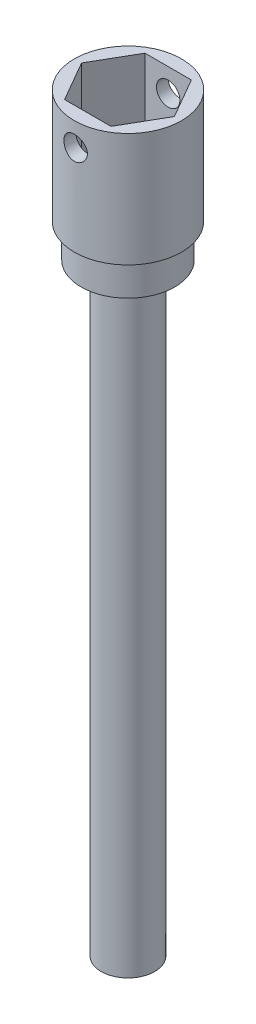
ISO-10303-21;
HEADER;
FILE_DESCRIPTION(('STEP AP214'),'2;1');
FILE_NAME('part.step','',(''),(''),'','','');
FILE_SCHEMA(('AUTOMOTIVE_DESIGN { 1 0 10303 214 1 1 1 1 }'));
ENDSEC;
DATA;
#1=APPLICATION_CONTEXT('core data for automotive mechanical design processes');
#2=APPLICATION_PROTOCOL_DEFINITION('international standard','automotive_design',2000,#1);
#3=PRODUCT_CONTEXT('',#1,'mechanical');
#4=PRODUCT('Part','Part','',(#3));
#5=PRODUCT_RELATED_PRODUCT_CATEGORY('part','',(#4));
#6=PRODUCT_DEFINITION_FORMATION('','',#4);
#7=PRODUCT_DEFINITION_CONTEXT('part definition',#1,'design');
#8=PRODUCT_DEFINITION('design','',#6,#7);
#9=PRODUCT_DEFINITION_SHAPE('','',#8);
#10=(LENGTH_UNIT() NAMED_UNIT(*) SI_UNIT(.MILLI.,.METRE.));
#11=(NAMED_UNIT(*) PLANE_ANGLE_UNIT() SI_UNIT($,.RADIAN.));
#12=(NAMED_UNIT(*) SI_UNIT($,.STERADIAN.) SOLID_ANGLE_UNIT());
#13=UNCERTAINTY_MEASURE_WITH_UNIT(LENGTH_MEASURE(1.E-05),#10,'distance_accuracy_value','');
#14=(GEOMETRIC_REPRESENTATION_CONTEXT(3) GLOBAL_UNCERTAINTY_ASSIGNED_CONTEXT((#13)) GLOBAL_UNIT_ASSIGNED_CONTEXT((#10,
#11,#12)) REPRESENTATION_CONTEXT('',''));
#15=CARTESIAN_POINT('',(0.,0.,0.));
#16=DIRECTION('',(0.,0.,1.));
#17=DIRECTION('',(1.,0.,0.));
#18=AXIS2_PLACEMENT_3D('',#15,#16,#17);
#19=CARTESIAN_POINT('',(0.,-5.,0.));
#20=DIRECTION('',(0.,-1.,0.));
#21=DIRECTION('',(0.,0.,-1.));
#22=AXIS2_PLACEMENT_3D('',#19,#20,#21);
#23=PLANE('',#22);
#24=CARTESIAN_POINT('',(0.,-5.,0.));
#25=DIRECTION('',(0.,-1.,0.));
#26=DIRECTION('',(0.,0.,-1.));
#27=AXIS2_PLACEMENT_3D('',#24,#25,#26);
#28=CIRCLE('',#27,7.);
#29=CARTESIAN_POINT('',(0.,-5.,-7.));
#30=VERTEX_POINT('',#29);
#31=EDGE_CURVE('E11',#30,#30,#28,.T.);
#32=ORIENTED_EDGE('',*,*,#31,.T.);
#33=EDGE_LOOP('',(#32));
#34=FACE_BOUND('',#33,.T.);
#35=CARTESIAN_POINT('',(0.,-5.,0.));
#36=DIRECTION('',(0.,-1.,0.));
#37=DIRECTION('',(0.,0.,-1.));
#38=AXIS2_PLACEMENT_3D('',#35,#36,#37);
#39=CIRCLE('',#38,4.005);
#40=CARTESIAN_POINT('',(0.,-5.,-4.005));
#41=VERTEX_POINT('',#40);
#42=EDGE_CURVE('E59',#41,#41,#39,.T.);
#43=ORIENTED_EDGE('',*,*,#42,.F.);
#44=EDGE_LOOP('',(#43));
#45=FACE_BOUND('',#44,.T.);
#46=ADVANCED_FACE('F48',(#34,#45),#23,.T.);
#47=CARTESIAN_POINT('',(0.,0.,0.));
#48=DIRECTION('',(0.,-1.,0.));
#49=DIRECTION('',(0.,0.,-1.));
#50=AXIS2_PLACEMENT_3D('',#47,#48,#49);
#51=PLANE('',#50);
#52=CARTESIAN_POINT('',(0.,0.,0.));
#53=DIRECTION('',(0.,-1.,0.));
#54=DIRECTION('',(0.,0.,-1.));
#55=AXIS2_PLACEMENT_3D('',#52,#53,#54);
#56=CIRCLE('',#55,7.);
#57=CARTESIAN_POINT('',(0.,0.,-7.));
#58=VERTEX_POINT('',#57);
#59=EDGE_CURVE('E52',#58,#58,#56,.T.);
#60=ORIENTED_EDGE('',*,*,#59,.F.);
#61=EDGE_LOOP('',(#60));
#62=FACE_BOUND('',#61,.T.);
#63=CARTESIAN_POINT('',(0.,0.,0.));
#64=DIRECTION('',(0.,-1.,0.));
#65=DIRECTION('',(0.,0.,-1.));
#66=AXIS2_PLACEMENT_3D('',#63,#64,#65);
#67=CIRCLE('',#66,4.005);
#68=CARTESIAN_POINT('',(0.,0.,-4.005));
#69=VERTEX_POINT('',#68);
#70=EDGE_CURVE('E61',#69,#69,#67,.T.);
#71=ORIENTED_EDGE('',*,*,#70,.T.);
#72=EDGE_LOOP('',(#71));
#73=FACE_BOUND('',#72,.T.);
#74=ADVANCED_FACE('F71',(#62,#73),#51,.F.);
#75=CARTESIAN_POINT('',(0.,-5.,0.));
#76=DIRECTION('',(0.,1.,0.));
#77=DIRECTION('',(0.,0.,1.));
#78=AXIS2_PLACEMENT_3D('',#75,#76,#77);
#79=CYLINDRICAL_SURFACE('',#78,7.);
#80=ORIENTED_EDGE('',*,*,#31,.F.);
#81=EDGE_LOOP('',(#80));
#82=FACE_BOUND('',#81,.T.);
#83=ORIENTED_EDGE('',*,*,#59,.T.);
#84=EDGE_LOOP('',(#83));
#85=FACE_BOUND('',#84,.T.);
#86=ADVANCED_FACE('F50',(#82,#85),#79,.T.);
#87=CARTESIAN_POINT('',(0.,-5.,0.));
#88=DIRECTION('',(0.,1.,0.));
#89=DIRECTION('',(0.,0.,1.));
#90=AXIS2_PLACEMENT_3D('',#87,#88,#89);
#91=CYLINDRICAL_SURFACE('',#90,4.005);
#92=ORIENTED_EDGE('',*,*,#42,.T.);
#93=EDGE_LOOP('',(#92));
#94=FACE_BOUND('',#93,.T.);
#95=ORIENTED_EDGE('',*,*,#70,.F.);
#96=EDGE_LOOP('',(#95));
#97=FACE_BOUND('',#96,.T.);
#98=ADVANCED_FACE('F67',(#94,#97),#91,.F.);
#99=CLOSED_SHELL('',(#46,#74,#86,#98));
#100=MANIFOLD_SOLID_BREP('B2',#99);
#101=CARTESIAN_POINT('',(0.,-95.,0.));
#102=DIRECTION('',(0.,1.,0.));
#103=DIRECTION('',(0.,0.,1.));
#104=AXIS2_PLACEMENT_3D('',#101,#102,#103);
#105=CYLINDRICAL_SURFACE('',#104,4.);
#106=CARTESIAN_POINT('',(0.,-95.,0.));
#107=DIRECTION('',(0.,-1.,0.));
#108=DIRECTION('',(0.,0.,-1.));
#109=AXIS2_PLACEMENT_3D('',#106,#107,#108);
#110=CIRCLE('',#109,4.);
#111=CARTESIAN_POINT('',(0.,-95.,-4.));
#112=VERTEX_POINT('',#111);
#113=EDGE_CURVE('E47',#112,#112,#110,.T.);
#114=ORIENTED_EDGE('',*,*,#113,.F.);
#115=EDGE_LOOP('',(#114));
#116=FACE_BOUND('',#115,.T.);
#117=CARTESIAN_POINT('',(0.,0.,0.));
#118=DIRECTION('',(0.,-1.,0.));
#119=DIRECTION('',(0.,0.,-1.));
#120=AXIS2_PLACEMENT_3D('',#117,#118,#119);
#121=CIRCLE('',#120,4.);
#122=CARTESIAN_POINT('',(0.,0.,-4.));
#123=VERTEX_POINT('',#122);
#124=EDGE_CURVE('E122',#123,#123,#121,.T.);
#125=ORIENTED_EDGE('',*,*,#124,.T.);
#126=EDGE_LOOP('',(#125));
#127=FACE_BOUND('',#126,.T.);
#128=ADVANCED_FACE('F119',(#116,#127),#105,.T.);
#129=CARTESIAN_POINT('',(0.,-95.,0.));
#130=DIRECTION('',(0.,-1.,0.));
#131=DIRECTION('',(0.,0.,-1.));
#132=AXIS2_PLACEMENT_3D('',#129,#130,#131);
#133=PLANE('',#132);
#134=ORIENTED_EDGE('',*,*,#113,.T.);
#135=EDGE_LOOP('',(#134));
#136=FACE_BOUND('',#135,.T.);
#137=ADVANCED_FACE('F134',(#136),#133,.T.);
#138=CARTESIAN_POINT('',(0.,0.,0.));
#139=DIRECTION('',(0.,-1.,0.));
#140=DIRECTION('',(0.,0.,-1.));
#141=AXIS2_PLACEMENT_3D('',#138,#139,#140);
#142=PLANE('',#141);
#143=ORIENTED_EDGE('',*,*,#124,.F.);
#144=EDGE_LOOP('',(#143));
#145=FACE_BOUND('',#144,.T.);
#146=ADVANCED_FACE('F132',(#145),#142,.F.);
#147=CLOSED_SHELL('',(#128,#137,#146));
#148=MANIFOLD_SOLID_BREP('B6',#147);
#149=CARTESIAN_POINT('',(0.,17.,0.));
#150=DIRECTION('',(0.,1.,0.));
#151=DIRECTION('',(0.,0.,1.));
#152=AXIS2_PLACEMENT_3D('',#149,#150,#151);
#153=PLANE('',#152);
#154=CARTESIAN_POINT('',(0.,17.,0.));
#155=DIRECTION('',(0.,1.,0.));
#156=DIRECTION('',(0.,0.,1.));
#157=AXIS2_PLACEMENT_3D('',#154,#155,#156);
#158=CIRCLE('',#157,8.);
#159=CARTESIAN_POINT('',(0.,17.,8.));
#160=VERTEX_POINT('',#159);
#161=EDGE_CURVE('E117',#160,#160,#158,.T.);
#162=ORIENTED_EDGE('',*,*,#161,.T.);
#163=EDGE_LOOP('',(#162));
#164=FACE_BOUND('',#163,.T.);
#165=DIRECTION('',(0.5,0.,0.866025403784438));
#166=VECTOR('',#165,1.);
#167=CARTESIAN_POINT('',(-6.92820323027551,17.,0.));
#168=LINE('',#167,#166);
#169=CARTESIAN_POINT('',(-6.92820323027551,17.,0.));
#170=VERTEX_POINT('',#169);
#171=CARTESIAN_POINT('',(-3.46410161513773,17.,6.00000000000003));
#172=VERTEX_POINT('',#171);
#173=EDGE_CURVE('E224',#170,#172,#168,.T.);
#174=ORIENTED_EDGE('',*,*,#173,.F.);
#175=DIRECTION('',(-0.499999999999995,0.,0.866025403784442));
#176=VECTOR('',#175,1.);
#177=CARTESIAN_POINT('',(-3.46410161513782,17.,-5.99999999999996));
#178=LINE('',#177,#176);
#179=CARTESIAN_POINT('',(-3.46410161513782,17.,-5.99999999999996));
#180=VERTEX_POINT('',#179);
#181=EDGE_CURVE('E216',#180,#170,#178,.T.);
#182=ORIENTED_EDGE('',*,*,#181,.F.);
#183=DIRECTION('',(-1.,0.,0.));
#184=VECTOR('',#183,1.);
#185=CARTESIAN_POINT('',(3.4641016151377,17.,-6.00000000000003));
#186=LINE('',#185,#184);
#187=CARTESIAN_POINT('',(3.4641016151377,17.,-6.00000000000003));
#188=VERTEX_POINT('',#187);
#189=EDGE_CURVE('E245',#188,#180,#186,.T.);
#190=ORIENTED_EDGE('',*,*,#189,.F.);
#191=DIRECTION('',(-0.500000000000008,0.,-0.866025403784434));
#192=VECTOR('',#191,1.);
#193=CARTESIAN_POINT('',(6.92820323027552,17.,0.));
#194=LINE('',#193,#192);
#195=CARTESIAN_POINT('',(6.92820323027552,17.,0.));
#196=VERTEX_POINT('',#195);
#197=EDGE_CURVE('E243',#196,#188,#194,.T.);
#198=ORIENTED_EDGE('',*,*,#197,.F.);
#199=DIRECTION('',(0.499999999999996,0.,-0.866025403784441));
#200=VECTOR('',#199,1.);
#201=CARTESIAN_POINT('',(3.46410161513779,17.,6.));
#202=LINE('',#201,#200);
#203=CARTESIAN_POINT('',(3.46410161513779,17.,6.));
#204=VERTEX_POINT('',#203);
#205=EDGE_CURVE('E238',#204,#196,#202,.T.);
#206=ORIENTED_EDGE('',*,*,#205,.F.);
#207=DIRECTION('',(1.,0.,0.));
#208=VECTOR('',#207,1.);
#209=CARTESIAN_POINT('',(-3.46410161513773,17.,6.00000000000003));
#210=LINE('',#209,#208);
#211=EDGE_CURVE('E236',#172,#204,#210,.T.);
#212=ORIENTED_EDGE('',*,*,#211,.F.);
#213=EDGE_LOOP('',(#174,#182,#190,#198,#206,#212));
#214=FACE_BOUND('',#213,.T.);
#215=ADVANCED_FACE('F160',(#164,#214),#153,.T.);
#216=CARTESIAN_POINT('',(0.,0.,0.));
#217=DIRECTION('',(0.,1.,0.));
#218=DIRECTION('',(0.,0.,1.));
#219=AXIS2_PLACEMENT_3D('',#216,#217,#218);
#220=PLANE('',#219);
#221=CARTESIAN_POINT('',(0.,0.,0.));
#222=DIRECTION('',(0.,1.,0.));
#223=DIRECTION('',(0.,0.,1.));
#224=AXIS2_PLACEMENT_3D('',#221,#222,#223);
#225=CIRCLE('',#224,8.);
#226=CARTESIAN_POINT('',(0.,0.,8.));
#227=VERTEX_POINT('',#226);
#228=EDGE_CURVE('E170',#227,#227,#225,.T.);
#229=ORIENTED_EDGE('',*,*,#228,.F.);
#230=EDGE_LOOP('',(#229));
#231=FACE_BOUND('',#230,.T.);
#232=DIRECTION('',(-0.499999999999995,0.,0.866025403784442));
#233=VECTOR('',#232,1.);
#234=CARTESIAN_POINT('',(-3.46410161513782,0.,-5.99999999999996));
#235=LINE('',#234,#233);
#236=CARTESIAN_POINT('',(-3.46410161513782,0.,-5.99999999999996));
#237=VERTEX_POINT('',#236);
#238=CARTESIAN_POINT('',(-6.92820323027551,0.,0.));
#239=VERTEX_POINT('',#238);
#240=EDGE_CURVE('E186',#237,#239,#235,.T.);
#241=ORIENTED_EDGE('',*,*,#240,.T.);
#242=DIRECTION('',(0.5,0.,0.866025403784438));
#243=VECTOR('',#242,1.);
#244=CARTESIAN_POINT('',(-6.92820323027551,0.,0.));
#245=LINE('',#244,#243);
#246=CARTESIAN_POINT('',(-3.46410161513773,0.,6.00000000000003));
#247=VERTEX_POINT('',#246);
#248=EDGE_CURVE('E231',#239,#247,#245,.T.);
#249=ORIENTED_EDGE('',*,*,#248,.T.);
#250=DIRECTION('',(1.,0.,0.));
#251=VECTOR('',#250,1.);
#252=CARTESIAN_POINT('',(-3.46410161513773,0.,6.00000000000003));
#253=LINE('',#252,#251);
#254=CARTESIAN_POINT('',(3.46410161513779,0.,6.));
#255=VERTEX_POINT('',#254);
#256=EDGE_CURVE('E250',#247,#255,#253,.T.);
#257=ORIENTED_EDGE('',*,*,#256,.T.);
#258=DIRECTION('',(0.499999999999996,0.,-0.866025403784441));
#259=VECTOR('',#258,1.);
#260=CARTESIAN_POINT('',(3.46410161513779,0.,6.));
#261=LINE('',#260,#259);
#262=CARTESIAN_POINT('',(6.92820323027552,0.,0.));
#263=VERTEX_POINT('',#262);
#264=EDGE_CURVE('E253',#255,#263,#261,.T.);
#265=ORIENTED_EDGE('',*,*,#264,.T.);
#266=DIRECTION('',(-0.500000000000008,0.,-0.866025403784434));
#267=VECTOR('',#266,1.);
#268=CARTESIAN_POINT('',(6.92820323027552,0.,0.));
#269=LINE('',#268,#267);
#270=CARTESIAN_POINT('',(3.4641016151377,0.,-6.00000000000003));
#271=VERTEX_POINT('',#270);
#272=EDGE_CURVE('E256',#263,#271,#269,.T.);
#273=ORIENTED_EDGE('',*,*,#272,.T.);
#274=DIRECTION('',(-1.,0.,0.));
#275=VECTOR('',#274,1.);
#276=CARTESIAN_POINT('',(3.4641016151377,0.,-6.00000000000003));
#277=LINE('',#276,#275);
#278=EDGE_CURVE('E225',#271,#237,#277,.T.);
#279=ORIENTED_EDGE('',*,*,#278,.T.);
#280=EDGE_LOOP('',(#241,#249,#257,#265,#273,#279));
#281=FACE_BOUND('',#280,.T.);
#282=ADVANCED_FACE('F271',(#231,#281),#220,.F.);
#283=CARTESIAN_POINT('',(0.,17.,0.));
#284=DIRECTION('',(0.,-1.,0.));
#285=DIRECTION('',(0.,0.,-1.));
#286=AXIS2_PLACEMENT_3D('',#283,#284,#285);
#287=CYLINDRICAL_SURFACE('',#286,8.);
#288=CARTESIAN_POINT('',(0.,15.2499999999999,-8.));
#289=CARTESIAN_POINT('',(-0.0970593350151568,15.2499966857365,-7.99999820976199));
#290=CARTESIAN_POINT('',(-0.194158718935758,15.2418980133387,-7.99821570498197));
#291=CARTESIAN_POINT('',(-0.385599393425184,15.2097509472335,-7.99127711250709));
#292=CARTESIAN_POINT('',(-0.479938663088234,15.1856911578552,-7.98611861450843));
#293=CARTESIAN_POINT('',(-0.663064722809438,15.1224115117151,-7.973002390759));
#294=CARTESIAN_POINT('',(-0.75185720118225,15.08320749224,-7.96504759005983));
#295=CARTESIAN_POINT('',(-0.921601058551551,14.9908025033185,-7.94719730036193));
#296=CARTESIAN_POINT('',(-1.00255264012584,14.9376018956207,-7.93730186152161));
#297=CARTESIAN_POINT('',(-1.155619179022,14.8178102893751,-7.9164767370517));
#298=CARTESIAN_POINT('',(-1.2275902777149,14.751037686599,-7.90553422192293));
#299=CARTESIAN_POINT('',(-1.35940547452628,14.6063873870963,-7.88393863133686));
#300=CARTESIAN_POINT('',(-1.41924849117723,14.5285087010883,-7.87328558176462));
#301=CARTESIAN_POINT('',(-1.52574354875189,14.3627932344162,-7.85334859305538));
#302=CARTESIAN_POINT('',(-1.57224243577137,14.2748558768205,-7.84408109293136));
#303=CARTESIAN_POINT('',(-1.64974688983707,14.0921791579887,-7.82814863989338));
#304=CARTESIAN_POINT('',(-1.6807543098141,13.9974406117921,-7.82148337574742));
#305=CARTESIAN_POINT('',(-1.72592019766615,13.8054113049613,-7.8116407126826));
#306=CARTESIAN_POINT('',(-1.74033336961635,13.7081832087146,-7.80841064772011));
#307=CARTESIAN_POINT('',(-1.75269359259673,13.5126394392105,-7.80564592573969));
#308=CARTESIAN_POINT('',(-1.75064266801701,13.414323901147,-7.80611081439809));
#309=CARTESIAN_POINT('',(-1.73033788658276,13.2212896648966,-7.81063579363394));
#310=CARTESIAN_POINT('',(-1.71237992433052,13.1265380699422,-7.81463022611758));
#311=CARTESIAN_POINT('',(-1.66123961776059,12.9414258870834,-7.8256604106414));
#312=CARTESIAN_POINT('',(-1.62805641913033,12.8510655458941,-7.83269633334323));
#313=CARTESIAN_POINT('',(-1.54713590259171,12.6764690657103,-7.84908142575242));
#314=CARTESIAN_POINT('',(-1.49928481262597,12.5922874135789,-7.85844856683515));
#315=CARTESIAN_POINT('',(-1.39046682908876,12.4330390817803,-7.87842963219283));
#316=CARTESIAN_POINT('',(-1.32949814730239,12.357973647038,-7.88904372636513));
#317=CARTESIAN_POINT('',(-1.19460937489087,12.2173850396079,-7.91060446260823));
#318=CARTESIAN_POINT('',(-1.12043767851041,12.1521033752664,-7.92155333191846));
#319=CARTESIAN_POINT('',(-0.962075236204424,12.0348662374023,-7.94234089245358));
#320=CARTESIAN_POINT('',(-0.87788430875849,11.9829110053711,-7.95217956355851));
#321=CARTESIAN_POINT('',(-0.701578448800898,11.8937418423677,-7.96967012140718));
#322=CARTESIAN_POINT('',(-0.609447011102176,11.8565595639266,-7.97731730300528));
#323=CARTESIAN_POINT('',(-0.420039431240226,11.7982711330325,-7.98952827368579));
#324=CARTESIAN_POINT('',(-0.322764039566515,11.7771626423382,-7.99409251123072));
#325=CARTESIAN_POINT('',(-0.127901429629277,11.7519722661836,-7.99955949359536));
#326=CARTESIAN_POINT('',(-0.0303587923625141,11.7475604773187,-8.00053317276936));
#327=CARTESIAN_POINT('',(0.164069740933597,11.754994543501,-7.99890811067611));
#328=CARTESIAN_POINT('',(0.260955681068746,11.7668392956148,-7.99630961176511));
#329=CARTESIAN_POINT('',(0.450227474165031,11.8061766648839,-7.98787693126456));
#330=CARTESIAN_POINT('',(0.542651027433137,11.833496241809,-7.98207854907296));
#331=CARTESIAN_POINT('',(0.721603760326831,11.9028156860869,-7.96789511342712));
#332=CARTESIAN_POINT('',(0.808132436960034,11.9448168043023,-7.9595098395777));
#333=CARTESIAN_POINT('',(0.974203283713454,12.0429944136583,-7.94090779663355));
#334=CARTESIAN_POINT('',(1.05362808603414,12.0993647035378,-7.93066659115627));
#335=CARTESIAN_POINT('',(1.20200932191059,12.2244253113372,-7.90953858077061));
#336=CARTESIAN_POINT('',(1.27096439342607,12.2931172296854,-7.89865169211902));
#337=CARTESIAN_POINT('',(1.39775310506222,12.4423850233085,-7.87721432670252));
#338=CARTESIAN_POINT('',(1.45535830381521,12.5231566231091,-7.86667375069788));
#339=CARTESIAN_POINT('',(1.55618726114731,12.693421578692,-7.84735161891499));
#340=CARTESIAN_POINT('',(1.59941164199047,12.78291455688,-7.83856998703301));
#341=CARTESIAN_POINT('',(1.66996009440656,12.9676020353281,-7.82384388791898));
#342=CARTESIAN_POINT('',(1.69737356394435,13.0627610548624,-7.81788350386447));
#343=CARTESIAN_POINT('',(1.73578387332259,13.2564820046402,-7.80944608385001));
#344=CARTESIAN_POINT('',(1.74678333897319,13.3550433880131,-7.80696849073852));
#345=CARTESIAN_POINT('',(1.75194163710036,13.5504679246802,-7.80581228747135));
#346=CARTESIAN_POINT('',(1.74646267912382,13.6473212096173,-7.80705196674951));
#347=CARTESIAN_POINT('',(1.71962942041951,13.8386886230968,-7.81300583032521));
#348=CARTESIAN_POINT('',(1.69827530684459,13.9332027792018,-7.81771997366216));
#349=CARTESIAN_POINT('',(1.64047291068321,14.1169212316383,-7.83005176572581));
#350=CARTESIAN_POINT('',(1.60407735181825,14.2061428425726,-7.83765926522138));
#351=CARTESIAN_POINT('',(1.51727048968557,14.3772672915549,-7.85492457749755));
#352=CARTESIAN_POINT('',(1.46685772585975,14.4591693657495,-7.86458260391319));
#353=CARTESIAN_POINT('',(1.35224615086074,14.6151153484137,-7.88510483142733));
#354=CARTESIAN_POINT('',(1.28778921304296,14.6889668945064,-7.8959894715946));
#355=CARTESIAN_POINT('',(1.14744205512982,14.8249242469262,-7.91760116007138));
#356=CARTESIAN_POINT('',(1.07154919548317,14.8870273340813,-7.92832817136923));
#357=CARTESIAN_POINT('',(0.909297791240121,14.9984963348522,-7.94858104101301));
#358=CARTESIAN_POINT('',(0.822816221637395,15.0476865127493,-7.95808950687133));
#359=CARTESIAN_POINT('',(0.642622783374196,15.1307547003765,-7.97465942662438));
#360=CARTESIAN_POINT('',(0.548917055005199,15.1646455496341,-7.98172293121789));
#361=CARTESIAN_POINT('',(0.379265181966453,15.210114036239,-7.99134698819861));
#362=CARTESIAN_POINT('',(0.304236707923574,15.2250427289055,-7.99457176616468));
#363=CARTESIAN_POINT('',(0.152813724405265,15.2449867958046,-7.99889892979335));
#364=CARTESIAN_POINT('',(0.0764192756345309,15.2500026094719,-8.00000140953667));
#365=CARTESIAN_POINT('',(0.,15.2499999999999,-8.));
#366=B_SPLINE_CURVE_WITH_KNOTS('',3,(#288,#289,#290,#291,#292,#293,#294,#295,#296,#297,#298,
#299,#300,#301,#302,#303,#304,#305,#306,#307,#308,#309,#310,#311,#312,#313,#314,#315,#316,#317,
#318,#319,#320,#321,#322,#323,#324,#325,#326,#327,#328,#329,#330,#331,#332,#333,#334,#335,#336,
#337,#338,#339,#340,#341,#342,#343,#344,#345,#346,#347,#348,#349,#350,#351,#352,#353,#354,#355,
#356,#357,#358,#359,#360,#361,#362,#363,#364,#365),.UNSPECIFIED.,.T.,.F.,(4,2,2,2,2,2,2,2,2,2,2,
2,2,2,2,2,2,2,2,2,2,2,2,2,2,2,2,2,2,2,2,2,2,2,2,2,2,2,4),(0.,0.29089827923684,0.582004473361998,
0.87280705974439,1.16360213093147,1.45858009706573,1.75358435498014,2.05185017097233,
2.35008030291283,2.64366919108486,2.93722198074794,3.2254263046948,3.51364680222934,
3.80416202417264,4.09471687482157,4.39155618463566,4.68840087316595,4.98587819489094,
5.28331223455302,5.57483775277423,5.86634349327379,6.15465219015957,6.44298545684136,
6.73543477188134,7.02792210003636,7.32580107786366,7.62366716466516,7.91983211728085,
8.21594968619011,8.50560626091032,8.79525942091157,9.08390577736418,9.37258222133142,
9.66709530846808,9.96167647726491,10.2600801610665,10.5582329503543,10.7872806901085,
11.0163182760258),.UNSPECIFIED.);
#367=CARTESIAN_POINT('',(0.,15.2499999999999,-8.));
#368=VERTEX_POINT('',#367);
#369=EDGE_CURVE('E248',#368,#368,#366,.T.);
#370=ORIENTED_EDGE('',*,*,#369,.T.);
#371=EDGE_LOOP('',(#370));
#372=FACE_BOUND('',#371,.T.);
#373=CARTESIAN_POINT('',(1.74999999999989,13.5,7.80624749799802));
#374=CARTESIAN_POINT('',(1.74999666332337,13.4029719865672,7.80624945905138));
#375=CARTESIAN_POINT('',(1.74190303950993,13.3059038686892,7.80807622046457));
#376=CARTESIAN_POINT('',(1.70977784205162,13.114528095478,7.81517245186507));
#377=CARTESIAN_POINT('',(1.68573474711842,13.0202224871333,7.82044441049016));
#378=CARTESIAN_POINT('',(1.62250390010269,12.8371677516,7.83380603690743));
#379=CARTESIAN_POINT('',(1.58333276753274,12.7484126505749,7.84189261163068));
#380=CARTESIAN_POINT('',(1.49100532370978,12.5787319161546,7.85996859341368));
#381=CARTESIAN_POINT('',(1.43784930002618,12.4978061218132,7.86995796134538));
#382=CARTESIAN_POINT('',(1.31810359988603,12.3447125378059,7.89090255292064));
#383=CARTESIAN_POINT('',(1.25132229635403,12.272696298075,7.90187013375052));
#384=CARTESIAN_POINT('',(1.1066353778788,12.1407933874916,7.92342719705844));
#385=CARTESIAN_POINT('',(1.02872889891558,12.0809076596115,7.93401665008984));
#386=CARTESIAN_POINT('',(0.862987032725094,11.9743662323318,7.95375888221753));
#387=CARTESIAN_POINT('',(0.775055841165919,11.9278562952411,7.96289538073788));
#388=CARTESIAN_POINT('',(0.592392423905183,11.850329736974,7.97856268454443));
#389=CARTESIAN_POINT('',(0.497660962897078,11.8193113768744,7.98509378226925));
#390=CARTESIAN_POINT('',(0.305661830671458,11.7741251174167,7.99472708358188));
#391=CARTESIAN_POINT('',(0.208457182926288,11.7597007306068,7.99788142586321));
#392=CARTESIAN_POINT('',(0.0129599543264851,11.7473099404886,8.0005864524206));
#393=CARTESIAN_POINT('',(-0.0853325007561678,11.7493416539787,8.0001375490446));
#394=CARTESIAN_POINT('',(-0.278447020873001,11.7696143704453,7.99572650969378));
#395=CARTESIAN_POINT('',(-0.373299678484527,11.7875789110752,7.99182429717546));
#396=CARTESIAN_POINT('',(-0.558610512900482,11.8387667801186,7.98101337797755));
#397=CARTESIAN_POINT('',(-0.649068490776164,11.8719907985543,7.9741045353411));
#398=CARTESIAN_POINT('',(-0.823789626976209,11.9529990480669,7.95796028660624));
#399=CARTESIAN_POINT('',(-0.908002597477657,12.0008880699226,7.94870822179818));
#400=CARTESIAN_POINT('',(-1.06729782919222,12.1097887869978,7.92889198192016));
#401=CARTESIAN_POINT('',(-1.1423788441084,12.1708022702585,7.91832762815044));
#402=CARTESIAN_POINT('',(-1.28292311899121,12.3057250508591,7.89678896628589));
#403=CARTESIAN_POINT('',(-1.34815369731025,12.3798763056075,7.88581070205046));
#404=CARTESIAN_POINT('',(-1.46529720114584,12.5381789203944,7.86488750618514));
#405=CARTESIAN_POINT('',(-1.51720976551524,12.6223305515244,7.85494260258143));
#406=CARTESIAN_POINT('',(-1.60634709802241,12.7986214460871,7.83720169317003));
#407=CARTESIAN_POINT('',(-1.64352787918374,12.8907836437077,7.82941214351679));
#408=CARTESIAN_POINT('',(-1.7018041084034,13.0802586827382,7.81695337423894));
#409=CARTESIAN_POINT('',(-1.72290210868729,13.1775707042846,7.81228365953274));
#410=CARTESIAN_POINT('',(-1.74805293703087,13.3724569275024,7.80669425421976));
#411=CARTESIAN_POINT('',(-1.75244457285897,13.4699853182606,7.8057000358533));
#412=CARTESIAN_POINT('',(-1.74497530075208,13.6643807036213,7.80737314858982));
#413=CARTESIAN_POINT('',(-1.73311550957759,13.7612477432106,7.81004022809689));
#414=CARTESIAN_POINT('',(-1.69377399635069,13.9503909152049,7.81866504603975));
#415=CARTESIAN_POINT('',(-1.66647889658488,14.0427078240167,7.82458345002008));
#416=CARTESIAN_POINT('',(-1.59724364761113,14.2214579700726,7.83900857622703));
#417=CARTESIAN_POINT('',(-1.55530209637649,14.3078906431033,7.84751554623324));
#418=CARTESIAN_POINT('',(-1.45721807999334,14.4738849784343,7.86632301994175));
#419=CARTESIAN_POINT('',(-1.40086690882525,14.5533203592182,7.87664912166245));
#420=CARTESIAN_POINT('',(-1.27583634037907,14.7017316836939,7.89786385707838));
#421=CARTESIAN_POINT('',(-1.20715541178424,14.77070632623,7.90875256052719));
#422=CARTESIAN_POINT('',(-1.05788176090423,14.8975533701229,7.93011129182084));
#423=CARTESIAN_POINT('',(-0.977090811057837,14.9551947802289,7.94056972743613));
#424=CARTESIAN_POINT('',(-0.806775937992862,15.0560872427294,7.95967616453577));
#425=CARTESIAN_POINT('',(-0.717252422909743,15.099338967241,7.96832425057138));
#426=CARTESIAN_POINT('',(-0.5325714421154,15.1699026469348,7.98278670652031));
#427=CARTESIAN_POINT('',(-0.437454026381483,15.1973155838729,7.98861898874484));
#428=CARTESIAN_POINT('',(-0.243822113274753,15.2357388611448,7.99687014437095));
#429=CARTESIAN_POINT('',(-0.145308111983536,15.246751586483,7.99928951409338));
#430=CARTESIAN_POINT('',(0.050127677576044,15.2519545782728,8.00042750683747));
#431=CARTESIAN_POINT('',(0.147040003201541,15.2464897231803,7.99922200056368));
#432=CARTESIAN_POINT('',(0.338529305331029,15.2196641174078,7.99340825361615));
#433=CARTESIAN_POINT('',(0.433106323799588,15.1983036525808,7.98880007413319));
#434=CARTESIAN_POINT('',(0.616973514243718,15.1404584560634,7.97670437671939));
#435=CARTESIAN_POINT('',(0.706279729669918,15.1040226473477,7.9692261782973));
#436=CARTESIAN_POINT('',(0.877557024231092,15.0171087400605,7.95218899565129));
#437=CARTESIAN_POINT('',(0.959527390172482,14.9666292781165,7.94262980942252));
#438=CARTESIAN_POINT('',(1.11548832576438,14.8519365078448,7.92224687676355));
#439=CARTESIAN_POINT('',(1.18929788040876,14.7874806844927,7.91140257019294));
#440=CARTESIAN_POINT('',(1.32517104073317,14.647153999639,7.88978238696405));
#441=CARTESIAN_POINT('',(1.38723181070989,14.5712803902358,7.87900652743125));
#442=CARTESIAN_POINT('',(1.49864533674951,14.4090516072625,7.85858267483526));
#443=CARTESIAN_POINT('',(1.54781703198656,14.3225698222904,7.84895169360711));
#444=CARTESIAN_POINT('',(1.63085060859468,14.1423779767005,7.83212199429227));
#445=CARTESIAN_POINT('',(1.66472544549916,14.0486741118072,7.82492121927567));
#446=CARTESIAN_POINT('',(1.71015691938034,13.8790626393006,7.81509833526497));
#447=CARTESIAN_POINT('',(1.72506941603836,13.8040749485232,7.81180130346359));
#448=CARTESIAN_POINT('',(1.74499202826858,13.6527330776672,7.80737516581756));
#449=CARTESIAN_POINT('',(1.75000262658049,13.5763789643878,7.80624595428689));
#450=CARTESIAN_POINT('',(1.74999999999989,13.5,7.80624749799802));
#451=B_SPLINE_CURVE_WITH_KNOTS('',3,(#373,#374,#375,#376,#377,#378,#379,#380,#381,#382,#383,
#384,#385,#386,#387,#388,#389,#390,#391,#392,#393,#394,#395,#396,#397,#398,#399,#400,#401,#402,
#403,#404,#405,#406,#407,#408,#409,#410,#411,#412,#413,#414,#415,#416,#417,#418,#419,#420,#421,
#422,#423,#424,#425,#426,#427,#428,#429,#430,#431,#432,#433,#434,#435,#436,#437,#438,#439,#440,
#441,#442,#443,#444,#445,#446,#447,#448,#449,#450),.UNSPECIFIED.,.T.,.F.,(4,2,2,2,2,2,2,2,2,2,2,
2,2,2,2,2,2,2,2,2,2,2,2,2,2,2,2,2,2,2,2,2,2,2,2,2,2,2,4),(0.,0.290804115870681,
0.581818526599516,0.872514137052661,1.1632037704385,1.45830491896331,1.75342899855105,
2.05165686348635,2.34985124493551,2.6433718451538,2.93685885596562,3.225350867641,
3.51385592599746,3.80447264140698,4.09512897475694,4.3918343653758,4.68854780096209,
4.98614062158766,5.28368620646354,5.57516431760499,5.86662240004874,6.15462969113373,
6.44266455918145,6.73513424501099,7.02764027980806,7.32560034403575,7.62354648911688,
7.91957146995064,8.21555339708017,8.50538367763954,8.79520874626486,9.08410055231538,
9.37302041407585,9.6674247415532,9.96190003653302,10.260313714158,10.558474176849,
10.7874018788081,11.0163184197543),.UNSPECIFIED.);
#452=CARTESIAN_POINT('',(1.74999999999989,13.5,7.80624749799802));
#453=VERTEX_POINT('',#452);
#454=EDGE_CURVE('E318',#453,#453,#451,.T.);
#455=ORIENTED_EDGE('',*,*,#454,.T.);
#456=EDGE_LOOP('',(#455));
#457=FACE_BOUND('',#456,.T.);
#458=ORIENTED_EDGE('',*,*,#161,.F.);
#459=EDGE_LOOP('',(#458));
#460=FACE_BOUND('',#459,.T.);
#461=ORIENTED_EDGE('',*,*,#228,.T.);
#462=EDGE_LOOP('',(#461));
#463=FACE_BOUND('',#462,.T.);
#464=ADVANCED_FACE('F162',(#372,#457,#460,#463),#287,.T.);
#465=CARTESIAN_POINT('',(-3.46410161513782,17.,-5.99999999999996));
#466=DIRECTION('',(0.866025403784441,0.,0.499999999999995));
#467=DIRECTION('',(0.499999999999995,0.,-0.866025403784442));
#468=AXIS2_PLACEMENT_3D('',#465,#466,#467);
#469=PLANE('',#468);
#470=ORIENTED_EDGE('',*,*,#240,.F.);
#471=DIRECTION('',(0.,-1.,0.));
#472=VECTOR('',#471,1.);
#473=CARTESIAN_POINT('',(-3.46410161513782,17.,-5.99999999999996));
#474=LINE('',#473,#472);
#475=EDGE_CURVE('E220',#180,#237,#474,.T.);
#476=ORIENTED_EDGE('',*,*,#475,.F.);
#477=ORIENTED_EDGE('',*,*,#181,.T.);
#478=DIRECTION('',(0.,-1.,0.));
#479=VECTOR('',#478,1.);
#480=CARTESIAN_POINT('',(-6.92820323027551,17.,0.));
#481=LINE('',#480,#479);
#482=EDGE_CURVE('E219',#170,#239,#481,.T.);
#483=ORIENTED_EDGE('',*,*,#482,.T.);
#484=EDGE_LOOP('',(#470,#476,#477,#483));
#485=FACE_BOUND('',#484,.T.);
#486=ADVANCED_FACE('F218',(#485),#469,.T.);
#487=CARTESIAN_POINT('',(-6.92820323027551,17.,0.));
#488=DIRECTION('',(0.866025403784438,0.,-0.500000000000001));
#489=DIRECTION('',(-0.500000000000001,0.,-0.866025403784438));
#490=AXIS2_PLACEMENT_3D('',#487,#488,#489);
#491=PLANE('',#490);
#492=ORIENTED_EDGE('',*,*,#248,.F.);
#493=ORIENTED_EDGE('',*,*,#482,.F.);
#494=ORIENTED_EDGE('',*,*,#173,.T.);
#495=DIRECTION('',(0.,-1.,0.));
#496=VECTOR('',#495,1.);
#497=CARTESIAN_POINT('',(-3.46410161513773,17.,6.00000000000003));
#498=LINE('',#497,#496);
#499=EDGE_CURVE('E232',#172,#247,#498,.T.);
#500=ORIENTED_EDGE('',*,*,#499,.T.);
#501=EDGE_LOOP('',(#492,#493,#494,#500));
#502=FACE_BOUND('',#501,.T.);
#503=ADVANCED_FACE('F228',(#502),#491,.T.);
#504=CARTESIAN_POINT('',(-3.46410161513773,17.,6.00000000000003));
#505=DIRECTION('',(0.,0.,-1.));
#506=DIRECTION('',(-1.,0.,0.));
#507=AXIS2_PLACEMENT_3D('',#504,#505,#506);
#508=PLANE('',#507);
#509=CARTESIAN_POINT('',(0.,13.5,6.00000000000002));
#510=DIRECTION('',(0.,0.,-1.));
#511=DIRECTION('',(-1.,0.,0.));
#512=AXIS2_PLACEMENT_3D('',#509,#510,#511);
#513=CIRCLE('',#512,1.74999999999994);
#514=CARTESIAN_POINT('',(-1.75,13.5,6.00000000000002));
#515=VERTEX_POINT('',#514);
#516=EDGE_CURVE('E321',#515,#515,#513,.T.);
#517=ORIENTED_EDGE('',*,*,#516,.F.);
#518=EDGE_LOOP('',(#517));
#519=FACE_BOUND('',#518,.T.);
#520=ORIENTED_EDGE('',*,*,#256,.F.);
#521=ORIENTED_EDGE('',*,*,#499,.F.);
#522=ORIENTED_EDGE('',*,*,#211,.T.);
#523=DIRECTION('',(0.,-1.,0.));
#524=VECTOR('',#523,1.);
#525=CARTESIAN_POINT('',(3.46410161513779,17.,6.));
#526=LINE('',#525,#524);
#527=EDGE_CURVE('E265',#204,#255,#526,.T.);
#528=ORIENTED_EDGE('',*,*,#527,.T.);
#529=EDGE_LOOP('',(#520,#521,#522,#528));
#530=FACE_BOUND('',#529,.T.);
#531=ADVANCED_FACE('F286',(#519,#530),#508,.T.);
#532=CARTESIAN_POINT('',(3.46410161513779,17.,6.));
#533=DIRECTION('',(-0.866025403784441,0.,-0.499999999999996));
#534=DIRECTION('',(-0.499999999999996,0.,0.866025403784441));
#535=AXIS2_PLACEMENT_3D('',#532,#533,#534);
#536=PLANE('',#535);
#537=ORIENTED_EDGE('',*,*,#264,.F.);
#538=ORIENTED_EDGE('',*,*,#527,.F.);
#539=ORIENTED_EDGE('',*,*,#205,.T.);
#540=DIRECTION('',(0.,-1.,0.));
#541=VECTOR('',#540,1.);
#542=CARTESIAN_POINT('',(6.92820323027552,17.,0.));
#543=LINE('',#542,#541);
#544=EDGE_CURVE('E263',#196,#263,#543,.T.);
#545=ORIENTED_EDGE('',*,*,#544,.T.);
#546=EDGE_LOOP('',(#537,#538,#539,#545));
#547=FACE_BOUND('',#546,.T.);
#548=ADVANCED_FACE('F282',(#547),#536,.T.);
#549=CARTESIAN_POINT('',(6.92820323027552,17.,0.));
#550=DIRECTION('',(-0.866025403784434,0.,0.500000000000008));
#551=DIRECTION('',(0.500000000000008,0.,0.866025403784434));
#552=AXIS2_PLACEMENT_3D('',#549,#550,#551);
#553=PLANE('',#552);
#554=ORIENTED_EDGE('',*,*,#272,.F.);
#555=ORIENTED_EDGE('',*,*,#544,.F.);
#556=ORIENTED_EDGE('',*,*,#197,.T.);
#557=DIRECTION('',(0.,-1.,0.));
#558=VECTOR('',#557,1.);
#559=CARTESIAN_POINT('',(3.4641016151377,17.,-6.00000000000003));
#560=LINE('',#559,#558);
#561=EDGE_CURVE('E178',#188,#271,#560,.T.);
#562=ORIENTED_EDGE('',*,*,#561,.T.);
#563=EDGE_LOOP('',(#554,#555,#556,#562));
#564=FACE_BOUND('',#563,.T.);
#565=ADVANCED_FACE('F279',(#564),#553,.T.);
#566=CARTESIAN_POINT('',(3.4641016151377,17.,-6.00000000000003));
#567=DIRECTION('',(0.,0.,1.));
#568=DIRECTION('',(1.,0.,0.));
#569=AXIS2_PLACEMENT_3D('',#566,#567,#568);
#570=PLANE('',#569);
#571=CARTESIAN_POINT('',(0.,13.5,-5.99999999999999));
#572=DIRECTION('',(0.,0.,1.));
#573=DIRECTION('',(1.,0.,0.));
#574=AXIS2_PLACEMENT_3D('',#571,#572,#573);
#575=CIRCLE('',#574,1.74999999999994);
#576=CARTESIAN_POINT('',(1.74999999999989,13.5,-6.00000000000001));
#577=VERTEX_POINT('',#576);
#578=EDGE_CURVE('E165',#577,#577,#575,.T.);
#579=ORIENTED_EDGE('',*,*,#578,.F.);
#580=EDGE_LOOP('',(#579));
#581=FACE_BOUND('',#580,.T.);
#582=ORIENTED_EDGE('',*,*,#278,.F.);
#583=ORIENTED_EDGE('',*,*,#561,.F.);
#584=ORIENTED_EDGE('',*,*,#189,.T.);
#585=ORIENTED_EDGE('',*,*,#475,.T.);
#586=EDGE_LOOP('',(#582,#583,#584,#585));
#587=FACE_BOUND('',#586,.T.);
#588=ADVANCED_FACE('F275',(#581,#587),#570,.T.);
#589=CARTESIAN_POINT('',(0.,13.5,-8.));
#590=DIRECTION('',(0.,0.,1.));
#591=DIRECTION('',(1.,0.,0.));
#592=AXIS2_PLACEMENT_3D('',#589,#590,#591);
#593=CYLINDRICAL_SURFACE('',#592,1.74999999999994);
#594=ORIENTED_EDGE('',*,*,#578,.T.);
#595=EDGE_LOOP('',(#594));
#596=FACE_BOUND('',#595,.T.);
#597=ORIENTED_EDGE('',*,*,#369,.F.);
#598=EDGE_LOOP('',(#597));
#599=FACE_BOUND('',#598,.T.);
#600=ADVANCED_FACE('F332',(#596,#599),#593,.F.);
#601=ORIENTED_EDGE('',*,*,#516,.T.);
#602=EDGE_LOOP('',(#601));
#603=FACE_BOUND('',#602,.T.);
#604=ORIENTED_EDGE('',*,*,#454,.F.);
#605=EDGE_LOOP('',(#604));
#606=FACE_BOUND('',#605,.T.);
#607=ADVANCED_FACE('F336',(#603,#606),#593,.F.);
#608=CLOSED_SHELL('',(#215,#282,#464,#486,#503,#531,#548,#565,#588,#600,#607));
#609=MANIFOLD_SOLID_BREP('B42',#608);
#610=ADVANCED_BREP_SHAPE_REPRESENTATION('',(#18,#100,#148,#609),#14);
#611=SHAPE_DEFINITION_REPRESENTATION(#9,#610);
ENDSEC;
END-ISO-10303-21;
